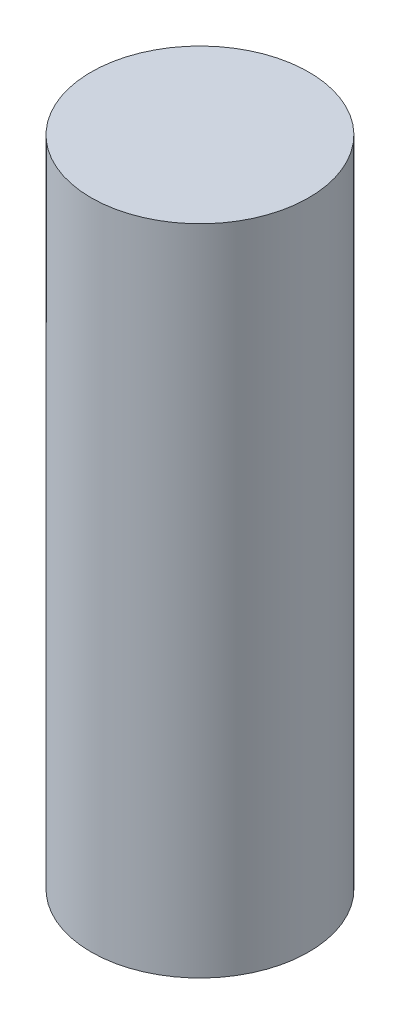
ISO-10303-21;
HEADER;
FILE_DESCRIPTION(('STEP AP214'),'2;1');
FILE_NAME('part.step','',(''),(''),'','','');
FILE_SCHEMA(('AUTOMOTIVE_DESIGN { 1 0 10303 214 1 1 1 1 }'));
ENDSEC;
DATA;
#1=APPLICATION_CONTEXT('core data for automotive mechanical design processes');
#2=APPLICATION_PROTOCOL_DEFINITION('international standard','automotive_design',2000,#1);
#3=PRODUCT_CONTEXT('',#1,'mechanical');
#4=PRODUCT('Part','Part','',(#3));
#5=PRODUCT_RELATED_PRODUCT_CATEGORY('part','',(#4));
#6=PRODUCT_DEFINITION_FORMATION('','',#4);
#7=PRODUCT_DEFINITION_CONTEXT('part definition',#1,'design');
#8=PRODUCT_DEFINITION('design','',#6,#7);
#9=PRODUCT_DEFINITION_SHAPE('','',#8);
#10=(LENGTH_UNIT() NAMED_UNIT(*) SI_UNIT(.MILLI.,.METRE.));
#11=(NAMED_UNIT(*) PLANE_ANGLE_UNIT() SI_UNIT($,.RADIAN.));
#12=(NAMED_UNIT(*) SI_UNIT($,.STERADIAN.) SOLID_ANGLE_UNIT());
#13=UNCERTAINTY_MEASURE_WITH_UNIT(LENGTH_MEASURE(1.E-05),#10,'distance_accuracy_value','');
#14=(GEOMETRIC_REPRESENTATION_CONTEXT(3) GLOBAL_UNCERTAINTY_ASSIGNED_CONTEXT((#13)) GLOBAL_UNIT_ASSIGNED_CONTEXT((#10,
#11,#12)) REPRESENTATION_CONTEXT('',''));
#15=CARTESIAN_POINT('',(0.,0.,0.));
#16=DIRECTION('',(0.,0.,1.));
#17=DIRECTION('',(1.,0.,0.));
#18=AXIS2_PLACEMENT_3D('',#15,#16,#17);
#19=CARTESIAN_POINT('',(0.,300.,0.));
#20=DIRECTION('',(0.,-1.,0.));
#21=DIRECTION('',(0.,0.,-1.));
#22=AXIS2_PLACEMENT_3D('',#19,#20,#21);
#23=CYLINDRICAL_SURFACE('',#22,50.);
#24=CARTESIAN_POINT('',(0.,300.,0.));
#25=DIRECTION('',(0.,1.,0.));
#26=DIRECTION('',(0.,0.,1.));
#27=AXIS2_PLACEMENT_3D('',#24,#25,#26);
#28=CIRCLE('',#27,50.);
#29=CARTESIAN_POINT('',(0.,300.,50.));
#30=VERTEX_POINT('',#29);
#31=EDGE_CURVE('E10',#30,#30,#28,.T.);
#32=ORIENTED_EDGE('',*,*,#31,.F.);
#33=EDGE_LOOP('',(#32));
#34=FACE_BOUND('',#33,.T.);
#35=CARTESIAN_POINT('',(0.,0.,0.));
#36=DIRECTION('',(0.,1.,0.));
#37=DIRECTION('',(0.,0.,1.));
#38=AXIS2_PLACEMENT_3D('',#35,#36,#37);
#39=CIRCLE('',#38,50.);
#40=CARTESIAN_POINT('',(0.,0.,50.));
#41=VERTEX_POINT('',#40);
#42=EDGE_CURVE('E43',#41,#41,#39,.T.);
#43=ORIENTED_EDGE('',*,*,#42,.T.);
#44=EDGE_LOOP('',(#43));
#45=FACE_BOUND('',#44,.T.);
#46=ADVANCED_FACE('F40',(#34,#45),#23,.T.);
#47=CARTESIAN_POINT('',(0.,300.,0.));
#48=DIRECTION('',(0.,1.,0.));
#49=DIRECTION('',(0.,0.,1.));
#50=AXIS2_PLACEMENT_3D('',#47,#48,#49);
#51=PLANE('',#50);
#52=ORIENTED_EDGE('',*,*,#31,.T.);
#53=EDGE_LOOP('',(#52));
#54=FACE_BOUND('',#53,.T.);
#55=ADVANCED_FACE('F57',(#54),#51,.T.);
#56=CARTESIAN_POINT('',(0.,0.,0.));
#57=DIRECTION('',(0.,1.,0.));
#58=DIRECTION('',(0.,0.,1.));
#59=AXIS2_PLACEMENT_3D('',#56,#57,#58);
#60=PLANE('',#59);
#61=ORIENTED_EDGE('',*,*,#42,.F.);
#62=EDGE_LOOP('',(#61));
#63=FACE_BOUND('',#62,.T.);
#64=ADVANCED_FACE('F55',(#63),#60,.F.);
#65=CLOSED_SHELL('',(#46,#55,#64));
#66=MANIFOLD_SOLID_BREP('B2',#65);
#67=ADVANCED_BREP_SHAPE_REPRESENTATION('',(#18,#66),#14);
#68=SHAPE_DEFINITION_REPRESENTATION(#9,#67);
ENDSEC;
END-ISO-10303-21;
